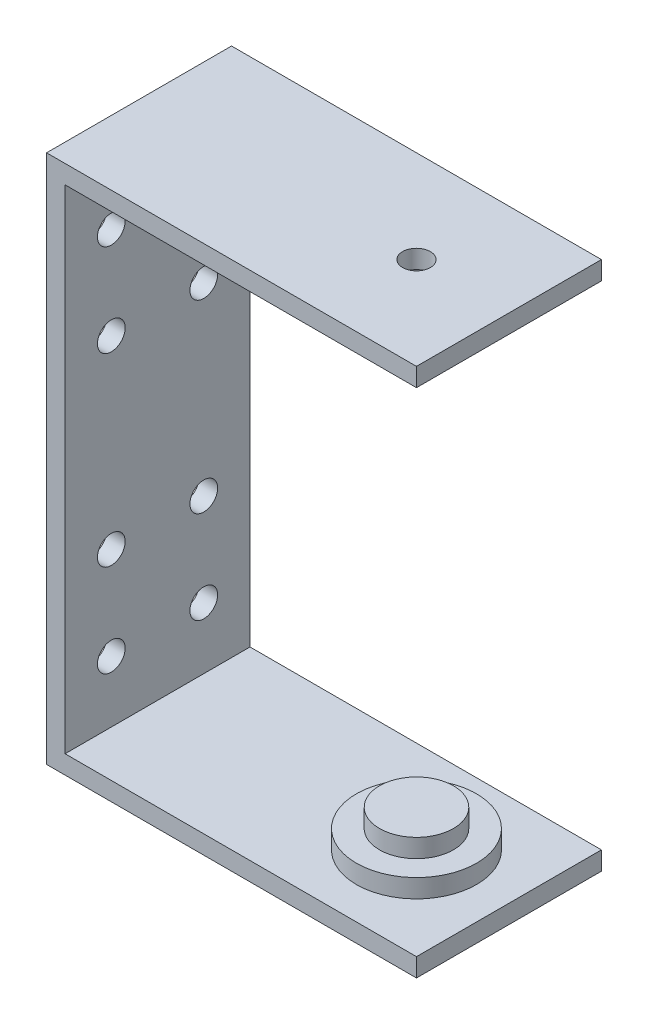
ISO-10303-21;
HEADER;
FILE_DESCRIPTION(('STEP AP214'),'2;1');
FILE_NAME('part.step','',(''),(''),'','','');
FILE_SCHEMA(('AUTOMOTIVE_DESIGN { 1 0 10303 214 1 1 1 1 }'));
ENDSEC;
DATA;
#1=APPLICATION_CONTEXT('core data for automotive mechanical design processes');
#2=APPLICATION_PROTOCOL_DEFINITION('international standard','automotive_design',2000,#1);
#3=PRODUCT_CONTEXT('',#1,'mechanical');
#4=PRODUCT('Part','Part','',(#3));
#5=PRODUCT_RELATED_PRODUCT_CATEGORY('part','',(#4));
#6=PRODUCT_DEFINITION_FORMATION('','',#4);
#7=PRODUCT_DEFINITION_CONTEXT('part definition',#1,'design');
#8=PRODUCT_DEFINITION('design','',#6,#7);
#9=PRODUCT_DEFINITION_SHAPE('','',#8);
#10=(LENGTH_UNIT() NAMED_UNIT(*) SI_UNIT(.MILLI.,.METRE.));
#11=(NAMED_UNIT(*) PLANE_ANGLE_UNIT() SI_UNIT($,.RADIAN.));
#12=(NAMED_UNIT(*) SI_UNIT($,.STERADIAN.) SOLID_ANGLE_UNIT());
#13=UNCERTAINTY_MEASURE_WITH_UNIT(LENGTH_MEASURE(1.E-05),#10,'distance_accuracy_value','');
#14=(GEOMETRIC_REPRESENTATION_CONTEXT(3) GLOBAL_UNCERTAINTY_ASSIGNED_CONTEXT((#13)) GLOBAL_UNIT_ASSIGNED_CONTEXT((#10,
#11,#12)) REPRESENTATION_CONTEXT('',''));
#15=CARTESIAN_POINT('',(0.,0.,0.));
#16=DIRECTION('',(0.,0.,1.));
#17=DIRECTION('',(1.,0.,0.));
#18=AXIS2_PLACEMENT_3D('',#15,#16,#17);
#19=CARTESIAN_POINT('',(0.,53.28,0.));
#20=DIRECTION('',(0.,-1.,0.));
#21=DIRECTION('',(0.,0.,-1.));
#22=AXIS2_PLACEMENT_3D('',#19,#20,#21);
#23=PLANE('',#22);
#24=CARTESIAN_POINT('',(0.,53.28,0.));
#25=DIRECTION('',(0.,1.,0.));
#26=DIRECTION('',(0.,0.,1.));
#27=AXIS2_PLACEMENT_3D('',#24,#25,#26);
#28=CIRCLE('',#27,1.5);
#29=CARTESIAN_POINT('',(0.,53.28,1.5));
#30=VERTEX_POINT('',#29);
#31=EDGE_CURVE('E308',#30,#30,#28,.T.);
#32=ORIENTED_EDGE('',*,*,#31,.T.);
#33=EDGE_LOOP('',(#32));
#34=FACE_BOUND('',#33,.T.);
#35=CARTESIAN_POINT('',(0.,53.28,0.));
#36=DIRECTION('',(0.,-1.,0.));
#37=DIRECTION('',(0.,0.,-1.));
#38=AXIS2_PLACEMENT_3D('',#35,#36,#37);
#39=CIRCLE('',#38,2.8);
#40=CARTESIAN_POINT('',(0.,53.28,-2.8));
#41=VERTEX_POINT('',#40);
#42=EDGE_CURVE('E12',#41,#41,#39,.F.);
#43=ORIENTED_EDGE('',*,*,#42,.F.);
#44=EDGE_LOOP('',(#43));
#45=FACE_BOUND('',#44,.T.);
#46=ADVANCED_FACE('F61',(#34,#45),#23,.T.);
#47=CARTESIAN_POINT('',(0.,0.,0.));
#48=DIRECTION('',(0.,-1.,0.));
#49=DIRECTION('',(0.,0.,-1.));
#50=AXIS2_PLACEMENT_3D('',#47,#48,#49);
#51=PLANE('',#50);
#52=CARTESIAN_POINT('',(0.,0.,0.));
#53=DIRECTION('',(0.,1.,0.));
#54=DIRECTION('',(0.,0.,1.));
#55=AXIS2_PLACEMENT_3D('',#52,#53,#54);
#56=CIRCLE('',#55,6.5);
#57=CARTESIAN_POINT('',(0.,0.,6.5));
#58=VERTEX_POINT('',#57);
#59=EDGE_CURVE('E228',#58,#58,#56,.T.);
#60=ORIENTED_EDGE('',*,*,#59,.F.);
#61=EDGE_LOOP('',(#60));
#62=FACE_BOUND('',#61,.T.);
#63=DIRECTION('',(0.,0.,-1.));
#64=VECTOR('',#63,1.);
#65=CARTESIAN_POINT('',(-28.,0.,-10.));
#66=LINE('',#65,#64);
#67=CARTESIAN_POINT('',(-28.,0.,10.));
#68=VERTEX_POINT('',#67);
#69=CARTESIAN_POINT('',(-28.,0.,-10.));
#70=VERTEX_POINT('',#69);
#71=EDGE_CURVE('E189',#68,#70,#66,.T.);
#72=ORIENTED_EDGE('',*,*,#71,.F.);
#73=DIRECTION('',(1.,0.,0.));
#74=VECTOR('',#73,1.);
#75=CARTESIAN_POINT('',(-30.,0.,10.));
#76=LINE('',#75,#74);
#77=CARTESIAN_POINT('',(10.,0.,10.));
#78=VERTEX_POINT('',#77);
#79=EDGE_CURVE('E104',#68,#78,#76,.T.);
#80=ORIENTED_EDGE('',*,*,#79,.T.);
#81=DIRECTION('',(0.,0.,-1.));
#82=VECTOR('',#81,1.);
#83=CARTESIAN_POINT('',(10.,0.,10.));
#84=LINE('',#83,#82);
#85=CARTESIAN_POINT('',(10.,0.,-10.));
#86=VERTEX_POINT('',#85);
#87=EDGE_CURVE('E214',#78,#86,#84,.T.);
#88=ORIENTED_EDGE('',*,*,#87,.T.);
#89=DIRECTION('',(1.,0.,0.));
#90=VECTOR('',#89,1.);
#91=CARTESIAN_POINT('',(-30.,0.,-10.));
#92=LINE('',#91,#90);
#93=EDGE_CURVE('E201',#70,#86,#92,.T.);
#94=ORIENTED_EDGE('',*,*,#93,.F.);
#95=EDGE_LOOP('',(#72,#80,#88,#94));
#96=FACE_BOUND('',#95,.T.);
#97=ADVANCED_FACE('F339',(#62,#96),#51,.F.);
#98=CARTESIAN_POINT('',(0.,2.,0.));
#99=DIRECTION('',(0.,-1.,0.));
#100=DIRECTION('',(0.,0.,-1.));
#101=AXIS2_PLACEMENT_3D('',#98,#99,#100);
#102=CYLINDRICAL_SURFACE('',#101,6.5);
#103=CARTESIAN_POINT('',(0.,2.,0.));
#104=DIRECTION('',(0.,1.,0.));
#105=DIRECTION('',(0.,0.,1.));
#106=AXIS2_PLACEMENT_3D('',#103,#104,#105);
#107=CIRCLE('',#106,6.5);
#108=CARTESIAN_POINT('',(0.,2.,6.5));
#109=VERTEX_POINT('',#108);
#110=EDGE_CURVE('E233',#109,#109,#107,.T.);
#111=ORIENTED_EDGE('',*,*,#110,.F.);
#112=EDGE_LOOP('',(#111));
#113=FACE_BOUND('',#112,.T.);
#114=ORIENTED_EDGE('',*,*,#59,.T.);
#115=EDGE_LOOP('',(#114));
#116=FACE_BOUND('',#115,.T.);
#117=ADVANCED_FACE('F63',(#113,#116),#102,.T.);
#118=CARTESIAN_POINT('',(0.,2.,0.));
#119=DIRECTION('',(0.,1.,0.));
#120=DIRECTION('',(0.,0.,1.));
#121=AXIS2_PLACEMENT_3D('',#118,#119,#120);
#122=PLANE('',#121);
#123=CARTESIAN_POINT('',(0.,2.,0.));
#124=DIRECTION('',(0.,1.,0.));
#125=DIRECTION('',(0.,0.,1.));
#126=AXIS2_PLACEMENT_3D('',#123,#124,#125);
#127=CIRCLE('',#126,4.);
#128=CARTESIAN_POINT('',(0.,2.,4.));
#129=VERTEX_POINT('',#128);
#130=EDGE_CURVE('E71',#129,#129,#127,.T.);
#131=ORIENTED_EDGE('',*,*,#130,.F.);
#132=EDGE_LOOP('',(#131));
#133=FACE_BOUND('',#132,.T.);
#134=ORIENTED_EDGE('',*,*,#110,.T.);
#135=EDGE_LOOP('',(#134));
#136=FACE_BOUND('',#135,.T.);
#137=ADVANCED_FACE('F389',(#133,#136),#122,.T.);
#138=CARTESIAN_POINT('',(0.,4.,0.));
#139=DIRECTION('',(0.,-1.,0.));
#140=DIRECTION('',(0.,0.,-1.));
#141=AXIS2_PLACEMENT_3D('',#138,#139,#140);
#142=CYLINDRICAL_SURFACE('',#141,4.);
#143=CARTESIAN_POINT('',(0.,4.,0.));
#144=DIRECTION('',(0.,1.,0.));
#145=DIRECTION('',(0.,0.,1.));
#146=AXIS2_PLACEMENT_3D('',#143,#144,#145);
#147=CIRCLE('',#146,4.);
#148=CARTESIAN_POINT('',(0.,4.,4.));
#149=VERTEX_POINT('',#148);
#150=EDGE_CURVE('E229',#149,#149,#147,.T.);
#151=ORIENTED_EDGE('',*,*,#150,.F.);
#152=EDGE_LOOP('',(#151));
#153=FACE_BOUND('',#152,.T.);
#154=ORIENTED_EDGE('',*,*,#130,.T.);
#155=EDGE_LOOP('',(#154));
#156=FACE_BOUND('',#155,.T.);
#157=ADVANCED_FACE('F386',(#153,#156),#142,.T.);
#158=CARTESIAN_POINT('',(0.,4.,0.));
#159=DIRECTION('',(0.,1.,0.));
#160=DIRECTION('',(0.,0.,1.));
#161=AXIS2_PLACEMENT_3D('',#158,#159,#160);
#162=PLANE('',#161);
#163=ORIENTED_EDGE('',*,*,#150,.T.);
#164=EDGE_LOOP('',(#163));
#165=FACE_BOUND('',#164,.T.);
#166=ADVANCED_FACE('F382',(#165),#162,.T.);
#167=CARTESIAN_POINT('',(-30.,-2.,10.));
#168=DIRECTION('',(1.,0.,0.));
#169=DIRECTION('',(0.,0.,-1.));
#170=AXIS2_PLACEMENT_3D('',#167,#168,#169);
#171=PLANE('',#170);
#172=CARTESIAN_POINT('',(-30.,46.64,-5.));
#173=DIRECTION('',(-1.,0.,0.));
#174=DIRECTION('',(0.,0.,1.));
#175=AXIS2_PLACEMENT_3D('',#172,#173,#174);
#176=CIRCLE('',#175,1.49999999999999);
#177=CARTESIAN_POINT('',(-30.,46.64,-3.50000000000001));
#178=VERTEX_POINT('',#177);
#179=EDGE_CURVE('E576',#178,#178,#176,.T.);
#180=ORIENTED_EDGE('',*,*,#179,.F.);
#181=EDGE_LOOP('',(#180));
#182=FACE_BOUND('',#181,.T.);
#183=CARTESIAN_POINT('',(-30.,46.64,5.));
#184=DIRECTION('',(-1.,0.,0.));
#185=DIRECTION('',(0.,0.,1.));
#186=AXIS2_PLACEMENT_3D('',#183,#184,#185);
#187=CIRCLE('',#186,1.49999999999999);
#188=CARTESIAN_POINT('',(-30.,46.64,6.49999999999999));
#189=VERTEX_POINT('',#188);
#190=EDGE_CURVE('E279',#189,#189,#187,.T.);
#191=ORIENTED_EDGE('',*,*,#190,.F.);
#192=EDGE_LOOP('',(#191));
#193=FACE_BOUND('',#192,.T.);
#194=CARTESIAN_POINT('',(-30.,36.64,-5.));
#195=DIRECTION('',(-1.,0.,0.));
#196=DIRECTION('',(0.,0.,1.));
#197=AXIS2_PLACEMENT_3D('',#194,#195,#196);
#198=CIRCLE('',#197,1.49999999999999);
#199=CARTESIAN_POINT('',(-30.,36.64,-3.50000000000001));
#200=VERTEX_POINT('',#199);
#201=EDGE_CURVE('E266',#200,#200,#198,.T.);
#202=ORIENTED_EDGE('',*,*,#201,.F.);
#203=EDGE_LOOP('',(#202));
#204=FACE_BOUND('',#203,.T.);
#205=CARTESIAN_POINT('',(-30.,36.64,5.));
#206=DIRECTION('',(-1.,0.,0.));
#207=DIRECTION('',(0.,0.,1.));
#208=AXIS2_PLACEMENT_3D('',#205,#206,#207);
#209=CIRCLE('',#208,1.49999999999999);
#210=CARTESIAN_POINT('',(-30.,36.64,6.49999999999999));
#211=VERTEX_POINT('',#210);
#212=EDGE_CURVE('E262',#211,#211,#209,.T.);
#213=ORIENTED_EDGE('',*,*,#212,.F.);
#214=EDGE_LOOP('',(#213));
#215=FACE_BOUND('',#214,.T.);
#216=CARTESIAN_POINT('',(-30.,16.64,-5.));
#217=DIRECTION('',(-1.,0.,0.));
#218=DIRECTION('',(0.,0.,1.));
#219=AXIS2_PLACEMENT_3D('',#216,#217,#218);
#220=CIRCLE('',#219,1.49999999999999);
#221=CARTESIAN_POINT('',(-30.,16.64,-3.50000000000001));
#222=VERTEX_POINT('',#221);
#223=EDGE_CURVE('E258',#222,#222,#220,.T.);
#224=ORIENTED_EDGE('',*,*,#223,.F.);
#225=EDGE_LOOP('',(#224));
#226=FACE_BOUND('',#225,.T.);
#227=CARTESIAN_POINT('',(-30.,16.64,5.));
#228=DIRECTION('',(-1.,0.,0.));
#229=DIRECTION('',(0.,0.,1.));
#230=AXIS2_PLACEMENT_3D('',#227,#228,#229);
#231=CIRCLE('',#230,1.49999999999999);
#232=CARTESIAN_POINT('',(-30.,16.64,6.49999999999999));
#233=VERTEX_POINT('',#232);
#234=EDGE_CURVE('E253',#233,#233,#231,.T.);
#235=ORIENTED_EDGE('',*,*,#234,.F.);
#236=EDGE_LOOP('',(#235));
#237=FACE_BOUND('',#236,.T.);
#238=CARTESIAN_POINT('',(-30.,6.64,-5.));
#239=DIRECTION('',(-1.,0.,0.));
#240=DIRECTION('',(0.,0.,1.));
#241=AXIS2_PLACEMENT_3D('',#238,#239,#240);
#242=CIRCLE('',#241,1.49999999999999);
#243=CARTESIAN_POINT('',(-30.,6.64,-3.50000000000001));
#244=VERTEX_POINT('',#243);
#245=EDGE_CURVE('E248',#244,#244,#242,.T.);
#246=ORIENTED_EDGE('',*,*,#245,.F.);
#247=EDGE_LOOP('',(#246));
#248=FACE_BOUND('',#247,.T.);
#249=CARTESIAN_POINT('',(-30.,6.64,5.));
#250=DIRECTION('',(-1.,0.,0.));
#251=DIRECTION('',(0.,0.,1.));
#252=AXIS2_PLACEMENT_3D('',#249,#250,#251);
#253=CIRCLE('',#252,1.49999999999999);
#254=CARTESIAN_POINT('',(-30.,6.64,6.49999999999999));
#255=VERTEX_POINT('',#254);
#256=EDGE_CURVE('E247',#255,#255,#253,.T.);
#257=ORIENTED_EDGE('',*,*,#256,.F.);
#258=EDGE_LOOP('',(#257));
#259=FACE_BOUND('',#258,.T.);
#260=DIRECTION('',(0.,1.,0.));
#261=VECTOR('',#260,1.);
#262=CARTESIAN_POINT('',(-30.,-2.,10.));
#263=LINE('',#262,#261);
#264=CARTESIAN_POINT('',(-30.,-2.,10.));
#265=VERTEX_POINT('',#264);
#266=CARTESIAN_POINT('',(-30.,55.28,10.));
#267=VERTEX_POINT('',#266);
#268=EDGE_CURVE('E88',#265,#267,#263,.T.);
#269=ORIENTED_EDGE('',*,*,#268,.T.);
#270=DIRECTION('',(0.,0.,1.));
#271=VECTOR('',#270,1.);
#272=CARTESIAN_POINT('',(-30.,55.28,0.));
#273=LINE('',#272,#271);
#274=CARTESIAN_POINT('',(-30.,55.28,-10.));
#275=VERTEX_POINT('',#274);
#276=EDGE_CURVE('E141',#275,#267,#273,.T.);
#277=ORIENTED_EDGE('',*,*,#276,.F.);
#278=DIRECTION('',(0.,1.,0.));
#279=VECTOR('',#278,1.);
#280=CARTESIAN_POINT('',(-30.,-2.,-10.));
#281=LINE('',#280,#279);
#282=CARTESIAN_POINT('',(-30.,-2.,-10.));
#283=VERTEX_POINT('',#282);
#284=EDGE_CURVE('E225',#283,#275,#281,.T.);
#285=ORIENTED_EDGE('',*,*,#284,.F.);
#286=DIRECTION('',(0.,0.,-1.));
#287=VECTOR('',#286,1.);
#288=CARTESIAN_POINT('',(-30.,-2.,10.));
#289=LINE('',#288,#287);
#290=EDGE_CURVE('E142',#265,#283,#289,.T.);
#291=ORIENTED_EDGE('',*,*,#290,.F.);
#292=EDGE_LOOP('',(#269,#277,#285,#291));
#293=FACE_BOUND('',#292,.T.);
#294=ADVANCED_FACE('F139',(#182,#193,#204,#215,#226,#237,#248,#259,#293),#171,.F.);
#295=CARTESIAN_POINT('',(-30.,-2.,-10.));
#296=DIRECTION('',(0.,0.,1.));
#297=DIRECTION('',(1.,0.,0.));
#298=AXIS2_PLACEMENT_3D('',#295,#296,#297);
#299=PLANE('',#298);
#300=ORIENTED_EDGE('',*,*,#284,.T.);
#301=DIRECTION('',(-1.,0.,0.));
#302=VECTOR('',#301,1.);
#303=CARTESIAN_POINT('',(0.,55.28,-10.));
#304=LINE('',#303,#302);
#305=CARTESIAN_POINT('',(10.,55.28,-10.));
#306=VERTEX_POINT('',#305);
#307=EDGE_CURVE('E157',#306,#275,#304,.T.);
#308=ORIENTED_EDGE('',*,*,#307,.F.);
#309=DIRECTION('',(0.,-1.,0.));
#310=VECTOR('',#309,1.);
#311=CARTESIAN_POINT('',(10.,55.28,-10.));
#312=LINE('',#311,#310);
#313=CARTESIAN_POINT('',(10.,53.28,-10.));
#314=VERTEX_POINT('',#313);
#315=EDGE_CURVE('E173',#306,#314,#312,.T.);
#316=ORIENTED_EDGE('',*,*,#315,.T.);
#317=DIRECTION('',(-1.,0.,0.));
#318=VECTOR('',#317,1.);
#319=CARTESIAN_POINT('',(0.,53.28,-10.));
#320=LINE('',#319,#318);
#321=CARTESIAN_POINT('',(-28.,53.28,-10.));
#322=VERTEX_POINT('',#321);
#323=EDGE_CURVE('E159',#314,#322,#320,.T.);
#324=ORIENTED_EDGE('',*,*,#323,.T.);
#325=DIRECTION('',(0.,-1.,0.));
#326=VECTOR('',#325,1.);
#327=CARTESIAN_POINT('',(-28.,53.28,-10.));
#328=LINE('',#327,#326);
#329=EDGE_CURVE('E79',#322,#70,#328,.T.);
#330=ORIENTED_EDGE('',*,*,#329,.T.);
#331=ORIENTED_EDGE('',*,*,#93,.T.);
#332=DIRECTION('',(0.,1.,0.));
#333=VECTOR('',#332,1.);
#334=CARTESIAN_POINT('',(10.,-2.,-10.));
#335=LINE('',#334,#333);
#336=CARTESIAN_POINT('',(10.,-2.,-10.));
#337=VERTEX_POINT('',#336);
#338=EDGE_CURVE('E221',#337,#86,#335,.T.);
#339=ORIENTED_EDGE('',*,*,#338,.F.);
#340=DIRECTION('',(1.,0.,0.));
#341=VECTOR('',#340,1.);
#342=CARTESIAN_POINT('',(-30.,-2.,-10.));
#343=LINE('',#342,#341);
#344=EDGE_CURVE('E111',#283,#337,#343,.T.);
#345=ORIENTED_EDGE('',*,*,#344,.F.);
#346=EDGE_LOOP('',(#300,#308,#316,#324,#330,#331,#339,#345));
#347=FACE_BOUND('',#346,.T.);
#348=ADVANCED_FACE('F360',(#347),#299,.F.);
#349=CARTESIAN_POINT('',(10.,-2.,10.));
#350=DIRECTION('',(1.,0.,0.));
#351=DIRECTION('',(0.,0.,-1.));
#352=AXIS2_PLACEMENT_3D('',#349,#350,#351);
#353=PLANE('',#352);
#354=ORIENTED_EDGE('',*,*,#87,.F.);
#355=DIRECTION('',(0.,1.,0.));
#356=VECTOR('',#355,1.);
#357=CARTESIAN_POINT('',(10.,-2.,10.));
#358=LINE('',#357,#356);
#359=CARTESIAN_POINT('',(10.,-2.,10.));
#360=VERTEX_POINT('',#359);
#361=EDGE_CURVE('E145',#360,#78,#358,.T.);
#362=ORIENTED_EDGE('',*,*,#361,.F.);
#363=DIRECTION('',(0.,0.,-1.));
#364=VECTOR('',#363,1.);
#365=CARTESIAN_POINT('',(10.,-2.,10.));
#366=LINE('',#365,#364);
#367=EDGE_CURVE('E206',#360,#337,#366,.T.);
#368=ORIENTED_EDGE('',*,*,#367,.T.);
#369=ORIENTED_EDGE('',*,*,#338,.T.);
#370=EDGE_LOOP('',(#354,#362,#368,#369));
#371=FACE_BOUND('',#370,.T.);
#372=ADVANCED_FACE('F362',(#371),#353,.T.);
#373=CARTESIAN_POINT('',(-30.,-2.,10.));
#374=DIRECTION('',(0.,0.,1.));
#375=DIRECTION('',(1.,0.,0.));
#376=AXIS2_PLACEMENT_3D('',#373,#374,#375);
#377=PLANE('',#376);
#378=ORIENTED_EDGE('',*,*,#79,.F.);
#379=DIRECTION('',(0.,-1.,0.));
#380=VECTOR('',#379,1.);
#381=CARTESIAN_POINT('',(-28.,53.28,10.));
#382=LINE('',#381,#380);
#383=CARTESIAN_POINT('',(-28.,53.28,10.));
#384=VERTEX_POINT('',#383);
#385=EDGE_CURVE('E198',#384,#68,#382,.T.);
#386=ORIENTED_EDGE('',*,*,#385,.F.);
#387=DIRECTION('',(-1.,0.,0.));
#388=VECTOR('',#387,1.);
#389=CARTESIAN_POINT('',(0.,53.28,10.));
#390=LINE('',#389,#388);
#391=CARTESIAN_POINT('',(10.,53.28,10.));
#392=VERTEX_POINT('',#391);
#393=EDGE_CURVE('E174',#392,#384,#390,.T.);
#394=ORIENTED_EDGE('',*,*,#393,.F.);
#395=DIRECTION('',(0.,-1.,0.));
#396=VECTOR('',#395,1.);
#397=CARTESIAN_POINT('',(10.,55.28,10.));
#398=LINE('',#397,#396);
#399=CARTESIAN_POINT('',(10.,55.28,10.));
#400=VERTEX_POINT('',#399);
#401=EDGE_CURVE('E163',#400,#392,#398,.T.);
#402=ORIENTED_EDGE('',*,*,#401,.F.);
#403=DIRECTION('',(-1.,0.,0.));
#404=VECTOR('',#403,1.);
#405=CARTESIAN_POINT('',(0.,55.28,10.));
#406=LINE('',#405,#404);
#407=EDGE_CURVE('E154',#400,#267,#406,.T.);
#408=ORIENTED_EDGE('',*,*,#407,.T.);
#409=ORIENTED_EDGE('',*,*,#268,.F.);
#410=DIRECTION('',(1.,0.,0.));
#411=VECTOR('',#410,1.);
#412=CARTESIAN_POINT('',(-30.,-2.,10.));
#413=LINE('',#412,#411);
#414=EDGE_CURVE('E146',#265,#360,#413,.T.);
#415=ORIENTED_EDGE('',*,*,#414,.T.);
#416=ORIENTED_EDGE('',*,*,#361,.T.);
#417=EDGE_LOOP('',(#378,#386,#394,#402,#408,#409,#415,#416));
#418=FACE_BOUND('',#417,.T.);
#419=ADVANCED_FACE('F161',(#418),#377,.T.);
#420=CARTESIAN_POINT('',(0.,-2.,0.));
#421=DIRECTION('',(0.,-1.,0.));
#422=DIRECTION('',(0.,0.,-1.));
#423=AXIS2_PLACEMENT_3D('',#420,#421,#422);
#424=PLANE('',#423);
#425=ORIENTED_EDGE('',*,*,#290,.T.);
#426=ORIENTED_EDGE('',*,*,#344,.T.);
#427=ORIENTED_EDGE('',*,*,#367,.F.);
#428=ORIENTED_EDGE('',*,*,#414,.F.);
#429=EDGE_LOOP('',(#425,#426,#427,#428));
#430=FACE_BOUND('',#429,.T.);
#431=ADVANCED_FACE('F365',(#430),#424,.T.);
#432=CARTESIAN_POINT('',(-28.,53.28,-10.));
#433=DIRECTION('',(-1.,0.,0.));
#434=DIRECTION('',(0.,0.,1.));
#435=AXIS2_PLACEMENT_3D('',#432,#433,#434);
#436=PLANE('',#435);
#437=CARTESIAN_POINT('',(-28.,46.64,-5.));
#438=DIRECTION('',(-1.,0.,0.));
#439=DIRECTION('',(0.,0.,1.));
#440=AXIS2_PLACEMENT_3D('',#437,#438,#439);
#441=CIRCLE('',#440,1.49999999999999);
#442=CARTESIAN_POINT('',(-28.,46.64,-3.50000000000001));
#443=VERTEX_POINT('',#442);
#444=EDGE_CURVE('E579',#443,#443,#441,.T.);
#445=ORIENTED_EDGE('',*,*,#444,.T.);
#446=EDGE_LOOP('',(#445));
#447=FACE_BOUND('',#446,.T.);
#448=CARTESIAN_POINT('',(-28.,46.64,5.));
#449=DIRECTION('',(-1.,0.,0.));
#450=DIRECTION('',(0.,0.,1.));
#451=AXIS2_PLACEMENT_3D('',#448,#449,#450);
#452=CIRCLE('',#451,1.49999999999999);
#453=CARTESIAN_POINT('',(-28.,46.64,6.49999999999999));
#454=VERTEX_POINT('',#453);
#455=EDGE_CURVE('E65',#454,#454,#452,.T.);
#456=ORIENTED_EDGE('',*,*,#455,.T.);
#457=EDGE_LOOP('',(#456));
#458=FACE_BOUND('',#457,.T.);
#459=CARTESIAN_POINT('',(-28.,36.64,-5.));
#460=DIRECTION('',(-1.,0.,0.));
#461=DIRECTION('',(0.,0.,1.));
#462=AXIS2_PLACEMENT_3D('',#459,#460,#461);
#463=CIRCLE('',#462,1.49999999999999);
#464=CARTESIAN_POINT('',(-28.,36.64,-3.50000000000001));
#465=VERTEX_POINT('',#464);
#466=EDGE_CURVE('E263',#465,#465,#463,.T.);
#467=ORIENTED_EDGE('',*,*,#466,.T.);
#468=EDGE_LOOP('',(#467));
#469=FACE_BOUND('',#468,.T.);
#470=CARTESIAN_POINT('',(-28.,36.64,5.));
#471=DIRECTION('',(-1.,0.,0.));
#472=DIRECTION('',(0.,0.,1.));
#473=AXIS2_PLACEMENT_3D('',#470,#471,#472);
#474=CIRCLE('',#473,1.49999999999999);
#475=CARTESIAN_POINT('',(-28.,36.64,6.49999999999999));
#476=VERTEX_POINT('',#475);
#477=EDGE_CURVE('E259',#476,#476,#474,.T.);
#478=ORIENTED_EDGE('',*,*,#477,.T.);
#479=EDGE_LOOP('',(#478));
#480=FACE_BOUND('',#479,.T.);
#481=CARTESIAN_POINT('',(-28.,16.64,-5.));
#482=DIRECTION('',(-1.,0.,0.));
#483=DIRECTION('',(0.,0.,1.));
#484=AXIS2_PLACEMENT_3D('',#481,#482,#483);
#485=CIRCLE('',#484,1.49999999999999);
#486=CARTESIAN_POINT('',(-28.,16.64,-3.50000000000001));
#487=VERTEX_POINT('',#486);
#488=EDGE_CURVE('E254',#487,#487,#485,.T.);
#489=ORIENTED_EDGE('',*,*,#488,.T.);
#490=EDGE_LOOP('',(#489));
#491=FACE_BOUND('',#490,.T.);
#492=CARTESIAN_POINT('',(-28.,16.64,5.));
#493=DIRECTION('',(-1.,0.,0.));
#494=DIRECTION('',(0.,0.,1.));
#495=AXIS2_PLACEMENT_3D('',#492,#493,#494);
#496=CIRCLE('',#495,1.49999999999999);
#497=CARTESIAN_POINT('',(-28.,16.64,6.49999999999999));
#498=VERTEX_POINT('',#497);
#499=EDGE_CURVE('E249',#498,#498,#496,.T.);
#500=ORIENTED_EDGE('',*,*,#499,.T.);
#501=EDGE_LOOP('',(#500));
#502=FACE_BOUND('',#501,.T.);
#503=CARTESIAN_POINT('',(-28.,6.64,-5.));
#504=DIRECTION('',(-1.,0.,0.));
#505=DIRECTION('',(0.,0.,1.));
#506=AXIS2_PLACEMENT_3D('',#503,#504,#505);
#507=CIRCLE('',#506,1.49999999999999);
#508=CARTESIAN_POINT('',(-28.,6.64,-3.50000000000001));
#509=VERTEX_POINT('',#508);
#510=EDGE_CURVE('E243',#509,#509,#507,.T.);
#511=ORIENTED_EDGE('',*,*,#510,.T.);
#512=EDGE_LOOP('',(#511));
#513=FACE_BOUND('',#512,.T.);
#514=CARTESIAN_POINT('',(-28.,6.64,5.));
#515=DIRECTION('',(-1.,0.,0.));
#516=DIRECTION('',(0.,0.,1.));
#517=AXIS2_PLACEMENT_3D('',#514,#515,#516);
#518=CIRCLE('',#517,1.49999999999999);
#519=CARTESIAN_POINT('',(-28.,6.64,6.49999999999999));
#520=VERTEX_POINT('',#519);
#521=EDGE_CURVE('E295',#520,#520,#518,.T.);
#522=ORIENTED_EDGE('',*,*,#521,.T.);
#523=EDGE_LOOP('',(#522));
#524=FACE_BOUND('',#523,.T.);
#525=ORIENTED_EDGE('',*,*,#71,.T.);
#526=ORIENTED_EDGE('',*,*,#329,.F.);
#527=DIRECTION('',(0.,0.,-1.));
#528=VECTOR('',#527,1.);
#529=CARTESIAN_POINT('',(-28.,53.28,-10.));
#530=LINE('',#529,#528);
#531=EDGE_CURVE('E190',#384,#322,#530,.T.);
#532=ORIENTED_EDGE('',*,*,#531,.F.);
#533=ORIENTED_EDGE('',*,*,#385,.T.);
#534=EDGE_LOOP('',(#525,#526,#532,#533));
#535=FACE_BOUND('',#534,.T.);
#536=ADVANCED_FACE('F351',(#447,#458,#469,#480,#491,#502,#513,#524,#535),#436,.F.);
#537=CARTESIAN_POINT('',(0.,55.28,0.));
#538=DIRECTION('',(0.,-1.,0.));
#539=DIRECTION('',(0.,0.,-1.));
#540=AXIS2_PLACEMENT_3D('',#537,#538,#539);
#541=PLANE('',#540);
#542=ORIENTED_EDGE('',*,*,#276,.T.);
#543=ORIENTED_EDGE('',*,*,#407,.F.);
#544=DIRECTION('',(0.,0.,1.));
#545=VECTOR('',#544,1.);
#546=CARTESIAN_POINT('',(10.,55.28,0.));
#547=LINE('',#546,#545);
#548=EDGE_CURVE('E165',#306,#400,#547,.T.);
#549=ORIENTED_EDGE('',*,*,#548,.F.);
#550=ORIENTED_EDGE('',*,*,#307,.T.);
#551=EDGE_LOOP('',(#542,#543,#549,#550));
#552=FACE_BOUND('',#551,.T.);
#553=CARTESIAN_POINT('',(0.,55.28,0.));
#554=DIRECTION('',(0.,1.,0.));
#555=DIRECTION('',(0.,0.,1.));
#556=AXIS2_PLACEMENT_3D('',#553,#554,#555);
#557=CIRCLE('',#556,1.5);
#558=CARTESIAN_POINT('',(0.,55.28,1.5));
#559=VERTEX_POINT('',#558);
#560=EDGE_CURVE('E179',#559,#559,#557,.T.);
#561=ORIENTED_EDGE('',*,*,#560,.F.);
#562=EDGE_LOOP('',(#561));
#563=FACE_BOUND('',#562,.T.);
#564=ADVANCED_FACE('F151',(#552,#563),#541,.F.);
#565=CARTESIAN_POINT('',(0.,53.28,0.));
#566=DIRECTION('',(0.,-1.,0.));
#567=DIRECTION('',(0.,0.,-1.));
#568=AXIS2_PLACEMENT_3D('',#565,#566,#567);
#569=CIRCLE('',#568,4.);
#570=CARTESIAN_POINT('',(0.,53.28,-4.));
#571=VERTEX_POINT('',#570);
#572=EDGE_CURVE('E303',#571,#571,#569,.T.);
#573=ORIENTED_EDGE('',*,*,#572,.F.);
#574=EDGE_LOOP('',(#573));
#575=FACE_BOUND('',#574,.T.);
#576=ORIENTED_EDGE('',*,*,#393,.T.);
#577=ORIENTED_EDGE('',*,*,#531,.T.);
#578=ORIENTED_EDGE('',*,*,#323,.F.);
#579=DIRECTION('',(0.,0.,1.));
#580=VECTOR('',#579,1.);
#581=CARTESIAN_POINT('',(10.,53.28,0.));
#582=LINE('',#581,#580);
#583=EDGE_CURVE('E178',#314,#392,#582,.T.);
#584=ORIENTED_EDGE('',*,*,#583,.T.);
#585=EDGE_LOOP('',(#576,#577,#578,#584));
#586=FACE_BOUND('',#585,.T.);
#587=ADVANCED_FACE('F333',(#575,#586),#23,.T.);
#588=CARTESIAN_POINT('',(10.,55.28,0.));
#589=DIRECTION('',(1.,0.,0.));
#590=DIRECTION('',(0.,0.,-1.));
#591=AXIS2_PLACEMENT_3D('',#588,#589,#590);
#592=PLANE('',#591);
#593=ORIENTED_EDGE('',*,*,#583,.F.);
#594=ORIENTED_EDGE('',*,*,#315,.F.);
#595=ORIENTED_EDGE('',*,*,#548,.T.);
#596=ORIENTED_EDGE('',*,*,#401,.T.);
#597=EDGE_LOOP('',(#593,#594,#595,#596));
#598=FACE_BOUND('',#597,.T.);
#599=ADVANCED_FACE('F323',(#598),#592,.T.);
#600=CARTESIAN_POINT('',(0.,55.28,0.));
#601=DIRECTION('',(0.,-1.,0.));
#602=DIRECTION('',(0.,0.,-1.));
#603=AXIS2_PLACEMENT_3D('',#600,#601,#602);
#604=CYLINDRICAL_SURFACE('',#603,1.5);
#605=ORIENTED_EDGE('',*,*,#560,.T.);
#606=EDGE_LOOP('',(#605));
#607=FACE_BOUND('',#606,.T.);
#608=ORIENTED_EDGE('',*,*,#31,.F.);
#609=EDGE_LOOP('',(#608));
#610=FACE_BOUND('',#609,.T.);
#611=ADVANCED_FACE('F320',(#607,#610),#604,.F.);
#612=CARTESIAN_POINT('',(0.,51.28,0.));
#613=DIRECTION('',(0.,-1.,0.));
#614=DIRECTION('',(0.,0.,-1.));
#615=AXIS2_PLACEMENT_3D('',#612,#613,#614);
#616=PLANE('',#615);
#617=CARTESIAN_POINT('',(0.,51.28,0.));
#618=DIRECTION('',(0.,-1.,0.));
#619=DIRECTION('',(0.,0.,-1.));
#620=AXIS2_PLACEMENT_3D('',#617,#618,#619);
#621=CIRCLE('',#620,4.);
#622=CARTESIAN_POINT('',(0.,51.28,-4.));
#623=VERTEX_POINT('',#622);
#624=EDGE_CURVE('E304',#623,#623,#621,.T.);
#625=ORIENTED_EDGE('',*,*,#624,.T.);
#626=EDGE_LOOP('',(#625));
#627=FACE_BOUND('',#626,.T.);
#628=CARTESIAN_POINT('',(0.,51.28,0.));
#629=DIRECTION('',(0.,-1.,0.));
#630=DIRECTION('',(0.,0.,-1.));
#631=AXIS2_PLACEMENT_3D('',#628,#629,#630);
#632=CIRCLE('',#631,2.8);
#633=CARTESIAN_POINT('',(0.,51.28,-2.8));
#634=VERTEX_POINT('',#633);
#635=EDGE_CURVE('E299',#634,#634,#632,.T.);
#636=ORIENTED_EDGE('',*,*,#635,.F.);
#637=EDGE_LOOP('',(#636));
#638=FACE_BOUND('',#637,.T.);
#639=ADVANCED_FACE('F322',(#627,#638),#616,.T.);
#640=CARTESIAN_POINT('',(0.,51.28,0.));
#641=DIRECTION('',(0.,1.,0.));
#642=DIRECTION('',(0.,0.,1.));
#643=AXIS2_PLACEMENT_3D('',#640,#641,#642);
#644=CYLINDRICAL_SURFACE('',#643,4.);
#645=ORIENTED_EDGE('',*,*,#624,.F.);
#646=EDGE_LOOP('',(#645));
#647=FACE_BOUND('',#646,.T.);
#648=ORIENTED_EDGE('',*,*,#572,.T.);
#649=EDGE_LOOP('',(#648));
#650=FACE_BOUND('',#649,.T.);
#651=ADVANCED_FACE('F330',(#647,#650),#644,.T.);
#652=CARTESIAN_POINT('',(0.,51.28,0.));
#653=DIRECTION('',(0.,1.,0.));
#654=DIRECTION('',(0.,0.,1.));
#655=AXIS2_PLACEMENT_3D('',#652,#653,#654);
#656=CYLINDRICAL_SURFACE('',#655,2.8);
#657=ORIENTED_EDGE('',*,*,#635,.T.);
#658=EDGE_LOOP('',(#657));
#659=FACE_BOUND('',#658,.T.);
#660=ORIENTED_EDGE('',*,*,#42,.T.);
#661=EDGE_LOOP('',(#660));
#662=FACE_BOUND('',#661,.T.);
#663=ADVANCED_FACE('F470',(#659,#662),#656,.F.);
#664=CARTESIAN_POINT('',(-30.,6.64,5.));
#665=DIRECTION('',(-1.,0.,0.));
#666=DIRECTION('',(0.,0.,1.));
#667=AXIS2_PLACEMENT_3D('',#664,#665,#666);
#668=CYLINDRICAL_SURFACE('',#667,1.49999999999999);
#669=ORIENTED_EDGE('',*,*,#256,.T.);
#670=EDGE_LOOP('',(#669));
#671=FACE_BOUND('',#670,.T.);
#672=ORIENTED_EDGE('',*,*,#521,.F.);
#673=EDGE_LOOP('',(#672));
#674=FACE_BOUND('',#673,.T.);
#675=ADVANCED_FACE('F479',(#671,#674),#668,.F.);
#676=CARTESIAN_POINT('',(-30.,6.64,-5.));
#677=DIRECTION('',(-1.,0.,0.));
#678=DIRECTION('',(0.,0.,1.));
#679=AXIS2_PLACEMENT_3D('',#676,#677,#678);
#680=CYLINDRICAL_SURFACE('',#679,1.49999999999999);
#681=ORIENTED_EDGE('',*,*,#245,.T.);
#682=EDGE_LOOP('',(#681));
#683=FACE_BOUND('',#682,.T.);
#684=ORIENTED_EDGE('',*,*,#510,.F.);
#685=EDGE_LOOP('',(#684));
#686=FACE_BOUND('',#685,.T.);
#687=ADVANCED_FACE('F500',(#683,#686),#680,.F.);
#688=CARTESIAN_POINT('',(-30.,16.64,5.));
#689=DIRECTION('',(-1.,0.,0.));
#690=DIRECTION('',(0.,0.,1.));
#691=AXIS2_PLACEMENT_3D('',#688,#689,#690);
#692=CYLINDRICAL_SURFACE('',#691,1.49999999999999);
#693=ORIENTED_EDGE('',*,*,#234,.T.);
#694=EDGE_LOOP('',(#693));
#695=FACE_BOUND('',#694,.T.);
#696=ORIENTED_EDGE('',*,*,#499,.F.);
#697=EDGE_LOOP('',(#696));
#698=FACE_BOUND('',#697,.T.);
#699=ADVANCED_FACE('F510',(#695,#698),#692,.F.);
#700=CARTESIAN_POINT('',(-30.,16.64,-5.));
#701=DIRECTION('',(-1.,0.,0.));
#702=DIRECTION('',(0.,0.,1.));
#703=AXIS2_PLACEMENT_3D('',#700,#701,#702);
#704=CYLINDRICAL_SURFACE('',#703,1.49999999999999);
#705=ORIENTED_EDGE('',*,*,#223,.T.);
#706=EDGE_LOOP('',(#705));
#707=FACE_BOUND('',#706,.T.);
#708=ORIENTED_EDGE('',*,*,#488,.F.);
#709=EDGE_LOOP('',(#708));
#710=FACE_BOUND('',#709,.T.);
#711=ADVANCED_FACE('F520',(#707,#710),#704,.F.);
#712=CARTESIAN_POINT('',(-30.,36.64,5.));
#713=DIRECTION('',(-1.,0.,0.));
#714=DIRECTION('',(0.,0.,1.));
#715=AXIS2_PLACEMENT_3D('',#712,#713,#714);
#716=CYLINDRICAL_SURFACE('',#715,1.49999999999999);
#717=ORIENTED_EDGE('',*,*,#212,.T.);
#718=EDGE_LOOP('',(#717));
#719=FACE_BOUND('',#718,.T.);
#720=ORIENTED_EDGE('',*,*,#477,.F.);
#721=EDGE_LOOP('',(#720));
#722=FACE_BOUND('',#721,.T.);
#723=ADVANCED_FACE('F530',(#719,#722),#716,.F.);
#724=CARTESIAN_POINT('',(-30.,36.64,-5.));
#725=DIRECTION('',(-1.,0.,0.));
#726=DIRECTION('',(0.,0.,1.));
#727=AXIS2_PLACEMENT_3D('',#724,#725,#726);
#728=CYLINDRICAL_SURFACE('',#727,1.49999999999999);
#729=ORIENTED_EDGE('',*,*,#201,.T.);
#730=EDGE_LOOP('',(#729));
#731=FACE_BOUND('',#730,.T.);
#732=ORIENTED_EDGE('',*,*,#466,.F.);
#733=EDGE_LOOP('',(#732));
#734=FACE_BOUND('',#733,.T.);
#735=ADVANCED_FACE('F540',(#731,#734),#728,.F.);
#736=CARTESIAN_POINT('',(-30.,46.64,5.));
#737=DIRECTION('',(-1.,0.,0.));
#738=DIRECTION('',(0.,0.,1.));
#739=AXIS2_PLACEMENT_3D('',#736,#737,#738);
#740=CYLINDRICAL_SURFACE('',#739,1.49999999999999);
#741=ORIENTED_EDGE('',*,*,#190,.T.);
#742=EDGE_LOOP('',(#741));
#743=FACE_BOUND('',#742,.T.);
#744=ORIENTED_EDGE('',*,*,#455,.F.);
#745=EDGE_LOOP('',(#744));
#746=FACE_BOUND('',#745,.T.);
#747=ADVANCED_FACE('F550',(#743,#746),#740,.F.);
#748=CARTESIAN_POINT('',(-30.,46.64,-5.));
#749=DIRECTION('',(-1.,0.,0.));
#750=DIRECTION('',(0.,0.,1.));
#751=AXIS2_PLACEMENT_3D('',#748,#749,#750);
#752=CYLINDRICAL_SURFACE('',#751,1.49999999999999);
#753=ORIENTED_EDGE('',*,*,#179,.T.);
#754=EDGE_LOOP('',(#753));
#755=FACE_BOUND('',#754,.T.);
#756=ORIENTED_EDGE('',*,*,#444,.F.);
#757=EDGE_LOOP('',(#756));
#758=FACE_BOUND('',#757,.T.);
#759=ADVANCED_FACE('F559',(#755,#758),#752,.F.);
#760=CLOSED_SHELL('',(#46,#97,#117,#137,#157,#166,#294,#348,#372,#419,#431,#536,#564,#587,#599,
#611,#639,#651,#663,#675,#687,#699,#711,#723,#735,#747,#759));
#761=MANIFOLD_SOLID_BREP('B2',#760);
#762=ADVANCED_BREP_SHAPE_REPRESENTATION('',(#18,#761),#14);
#763=SHAPE_DEFINITION_REPRESENTATION(#9,#762);
ENDSEC;
END-ISO-10303-21;
